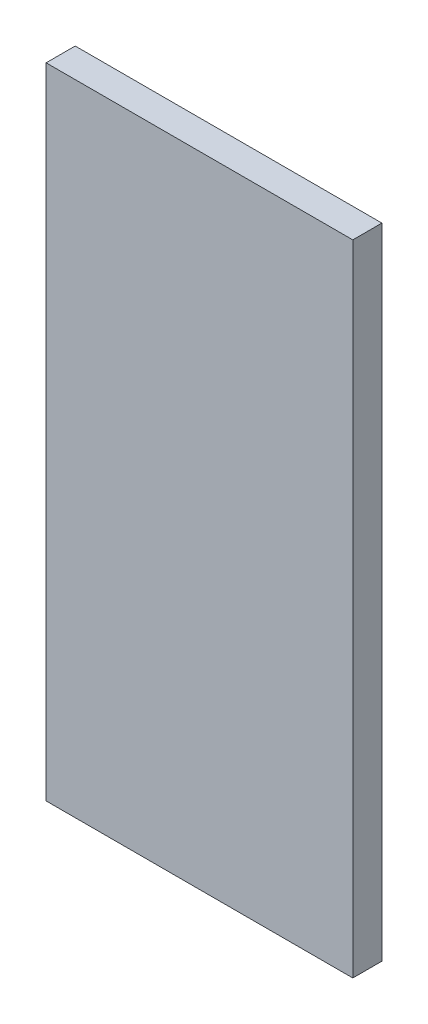
ISO-10303-21;
HEADER;
FILE_DESCRIPTION(('STEP AP214'),'2;1');
FILE_NAME('part.step','',(''),(''),'','','');
FILE_SCHEMA(('AUTOMOTIVE_DESIGN { 1 0 10303 214 1 1 1 1 }'));
ENDSEC;
DATA;
#1=APPLICATION_CONTEXT('core data for automotive mechanical design processes');
#2=APPLICATION_PROTOCOL_DEFINITION('international standard','automotive_design',2000,#1);
#3=PRODUCT_CONTEXT('',#1,'mechanical');
#4=PRODUCT('Part','Part','',(#3));
#5=PRODUCT_RELATED_PRODUCT_CATEGORY('part','',(#4));
#6=PRODUCT_DEFINITION_FORMATION('','',#4);
#7=PRODUCT_DEFINITION_CONTEXT('part definition',#1,'design');
#8=PRODUCT_DEFINITION('design','',#6,#7);
#9=PRODUCT_DEFINITION_SHAPE('','',#8);
#10=(LENGTH_UNIT() NAMED_UNIT(*) SI_UNIT(.MILLI.,.METRE.));
#11=(NAMED_UNIT(*) PLANE_ANGLE_UNIT() SI_UNIT($,.RADIAN.));
#12=(NAMED_UNIT(*) SI_UNIT($,.STERADIAN.) SOLID_ANGLE_UNIT());
#13=UNCERTAINTY_MEASURE_WITH_UNIT(LENGTH_MEASURE(1.E-05),#10,'distance_accuracy_value','');
#14=(GEOMETRIC_REPRESENTATION_CONTEXT(3) GLOBAL_UNCERTAINTY_ASSIGNED_CONTEXT((#13)) GLOBAL_UNIT_ASSIGNED_CONTEXT((#10,
#11,#12)) REPRESENTATION_CONTEXT('',''));
#15=CARTESIAN_POINT('',(0.,0.,0.));
#16=DIRECTION('',(0.,0.,1.));
#17=DIRECTION('',(1.,0.,0.));
#18=AXIS2_PLACEMENT_3D('',#15,#16,#17);
#19=CARTESIAN_POINT('',(-5.2705,-6.604,1.));
#20=DIRECTION('',(1.,0.,0.));
#21=DIRECTION('',(0.,0.,-1.));
#22=AXIS2_PLACEMENT_3D('',#19,#20,#21);
#23=PLANE('',#22);
#24=DIRECTION('',(0.,-1.,0.));
#25=VECTOR('',#24,1.);
#26=CARTESIAN_POINT('',(-5.2705,-6.604,0.));
#27=LINE('',#26,#25);
#28=CARTESIAN_POINT('',(-5.2705,15.367,0.));
#29=VERTEX_POINT('',#28);
#30=CARTESIAN_POINT('',(-5.2705,-6.604,0.));
#31=VERTEX_POINT('',#30);
#32=EDGE_CURVE('E95',#29,#31,#27,.T.);
#33=ORIENTED_EDGE('',*,*,#32,.T.);
#34=DIRECTION('',(0.,0.,-1.));
#35=VECTOR('',#34,1.);
#36=CARTESIAN_POINT('',(-5.2705,-6.604,1.));
#37=LINE('',#36,#35);
#38=CARTESIAN_POINT('',(-5.2705,-6.604,1.));
#39=VERTEX_POINT('',#38);
#40=EDGE_CURVE('E11',#39,#31,#37,.T.);
#41=ORIENTED_EDGE('',*,*,#40,.F.);
#42=DIRECTION('',(0.,-1.,0.));
#43=VECTOR('',#42,1.);
#44=CARTESIAN_POINT('',(-5.2705,-6.604,1.));
#45=LINE('',#44,#43);
#46=CARTESIAN_POINT('',(-5.2705,15.367,1.));
#47=VERTEX_POINT('',#46);
#48=EDGE_CURVE('E83',#47,#39,#45,.T.);
#49=ORIENTED_EDGE('',*,*,#48,.F.);
#50=DIRECTION('',(0.,0.,-1.));
#51=VECTOR('',#50,1.);
#52=CARTESIAN_POINT('',(-5.2705,15.367,1.));
#53=LINE('',#52,#51);
#54=EDGE_CURVE('E91',#47,#29,#53,.T.);
#55=ORIENTED_EDGE('',*,*,#54,.T.);
#56=EDGE_LOOP('',(#33,#41,#49,#55));
#57=FACE_BOUND('',#56,.T.);
#58=ADVANCED_FACE('F32',(#57),#23,.F.);
#59=CARTESIAN_POINT('',(5.2705,-6.604,1.));
#60=DIRECTION('',(0.,1.,0.));
#61=DIRECTION('',(0.,0.,1.));
#62=AXIS2_PLACEMENT_3D('',#59,#60,#61);
#63=PLANE('',#62);
#64=DIRECTION('',(1.,0.,0.));
#65=VECTOR('',#64,1.);
#66=CARTESIAN_POINT('',(5.2705,-6.604,0.));
#67=LINE('',#66,#65);
#68=CARTESIAN_POINT('',(5.2705,-6.604,0.));
#69=VERTEX_POINT('',#68);
#70=EDGE_CURVE('E87',#31,#69,#67,.T.);
#71=ORIENTED_EDGE('',*,*,#70,.T.);
#72=DIRECTION('',(0.,0.,-1.));
#73=VECTOR('',#72,1.);
#74=CARTESIAN_POINT('',(5.2705,-6.604,1.));
#75=LINE('',#74,#73);
#76=CARTESIAN_POINT('',(5.2705,-6.604,1.));
#77=VERTEX_POINT('',#76);
#78=EDGE_CURVE('E40',#77,#69,#75,.T.);
#79=ORIENTED_EDGE('',*,*,#78,.F.);
#80=DIRECTION('',(1.,0.,0.));
#81=VECTOR('',#80,1.);
#82=CARTESIAN_POINT('',(5.2705,-6.604,1.));
#83=LINE('',#82,#81);
#84=EDGE_CURVE('E78',#39,#77,#83,.T.);
#85=ORIENTED_EDGE('',*,*,#84,.F.);
#86=ORIENTED_EDGE('',*,*,#40,.T.);
#87=EDGE_LOOP('',(#71,#79,#85,#86));
#88=FACE_BOUND('',#87,.T.);
#89=ADVANCED_FACE('F86',(#88),#63,.F.);
#90=CARTESIAN_POINT('',(5.2705,15.367,1.));
#91=DIRECTION('',(-1.,0.,0.));
#92=DIRECTION('',(0.,0.,1.));
#93=AXIS2_PLACEMENT_3D('',#90,#91,#92);
#94=PLANE('',#93);
#95=DIRECTION('',(0.,1.,0.));
#96=VECTOR('',#95,1.);
#97=CARTESIAN_POINT('',(5.2705,15.367,0.));
#98=LINE('',#97,#96);
#99=CARTESIAN_POINT('',(5.2705,15.367,0.));
#100=VERTEX_POINT('',#99);
#101=EDGE_CURVE('E65',#69,#100,#98,.T.);
#102=ORIENTED_EDGE('',*,*,#101,.T.);
#103=DIRECTION('',(0.,0.,-1.));
#104=VECTOR('',#103,1.);
#105=CARTESIAN_POINT('',(5.2705,15.367,1.));
#106=LINE('',#105,#104);
#107=CARTESIAN_POINT('',(5.2705,15.367,1.));
#108=VERTEX_POINT('',#107);
#109=EDGE_CURVE('E88',#108,#100,#106,.T.);
#110=ORIENTED_EDGE('',*,*,#109,.F.);
#111=DIRECTION('',(0.,1.,0.));
#112=VECTOR('',#111,1.);
#113=CARTESIAN_POINT('',(5.2705,15.367,1.));
#114=LINE('',#113,#112);
#115=EDGE_CURVE('E81',#77,#108,#114,.T.);
#116=ORIENTED_EDGE('',*,*,#115,.F.);
#117=ORIENTED_EDGE('',*,*,#78,.T.);
#118=EDGE_LOOP('',(#102,#110,#116,#117));
#119=FACE_BOUND('',#118,.T.);
#120=ADVANCED_FACE('F89',(#119),#94,.F.);
#121=CARTESIAN_POINT('',(-5.2705,15.367,1.));
#122=DIRECTION('',(0.,-1.,0.));
#123=DIRECTION('',(0.,0.,-1.));
#124=AXIS2_PLACEMENT_3D('',#121,#122,#123);
#125=PLANE('',#124);
#126=DIRECTION('',(-1.,0.,0.));
#127=VECTOR('',#126,1.);
#128=CARTESIAN_POINT('',(-5.2705,15.367,0.));
#129=LINE('',#128,#127);
#130=EDGE_CURVE('E71',#100,#29,#129,.T.);
#131=ORIENTED_EDGE('',*,*,#130,.T.);
#132=ORIENTED_EDGE('',*,*,#54,.F.);
#133=DIRECTION('',(-1.,0.,0.));
#134=VECTOR('',#133,1.);
#135=CARTESIAN_POINT('',(-5.2705,15.367,1.));
#136=LINE('',#135,#134);
#137=EDGE_CURVE('E48',#108,#47,#136,.T.);
#138=ORIENTED_EDGE('',*,*,#137,.F.);
#139=ORIENTED_EDGE('',*,*,#109,.T.);
#140=EDGE_LOOP('',(#131,#132,#138,#139));
#141=FACE_BOUND('',#140,.T.);
#142=ADVANCED_FACE('F102',(#141),#125,.F.);
#143=CARTESIAN_POINT('',(0.,0.,1.));
#144=DIRECTION('',(0.,0.,-1.));
#145=DIRECTION('',(-1.,0.,0.));
#146=AXIS2_PLACEMENT_3D('',#143,#144,#145);
#147=PLANE('',#146);
#148=ORIENTED_EDGE('',*,*,#48,.T.);
#149=ORIENTED_EDGE('',*,*,#84,.T.);
#150=ORIENTED_EDGE('',*,*,#115,.T.);
#151=ORIENTED_EDGE('',*,*,#137,.T.);
#152=EDGE_LOOP('',(#148,#149,#150,#151));
#153=FACE_BOUND('',#152,.T.);
#154=ADVANCED_FACE('F79',(#153),#147,.F.);
#155=CARTESIAN_POINT('',(0.,0.,0.));
#156=DIRECTION('',(0.,0.,-1.));
#157=DIRECTION('',(-1.,0.,0.));
#158=AXIS2_PLACEMENT_3D('',#155,#156,#157);
#159=PLANE('',#158);
#160=ORIENTED_EDGE('',*,*,#32,.F.);
#161=ORIENTED_EDGE('',*,*,#130,.F.);
#162=ORIENTED_EDGE('',*,*,#101,.F.);
#163=ORIENTED_EDGE('',*,*,#70,.F.);
#164=EDGE_LOOP('',(#160,#161,#162,#163));
#165=FACE_BOUND('',#164,.T.);
#166=ADVANCED_FACE('F105',(#165),#159,.T.);
#167=CLOSED_SHELL('',(#58,#89,#120,#142,#154,#166));
#168=MANIFOLD_SOLID_BREP('B2',#167);
#169=ADVANCED_BREP_SHAPE_REPRESENTATION('',(#18,#168),#14);
#170=SHAPE_DEFINITION_REPRESENTATION(#9,#169);
ENDSEC;
END-ISO-10303-21;
